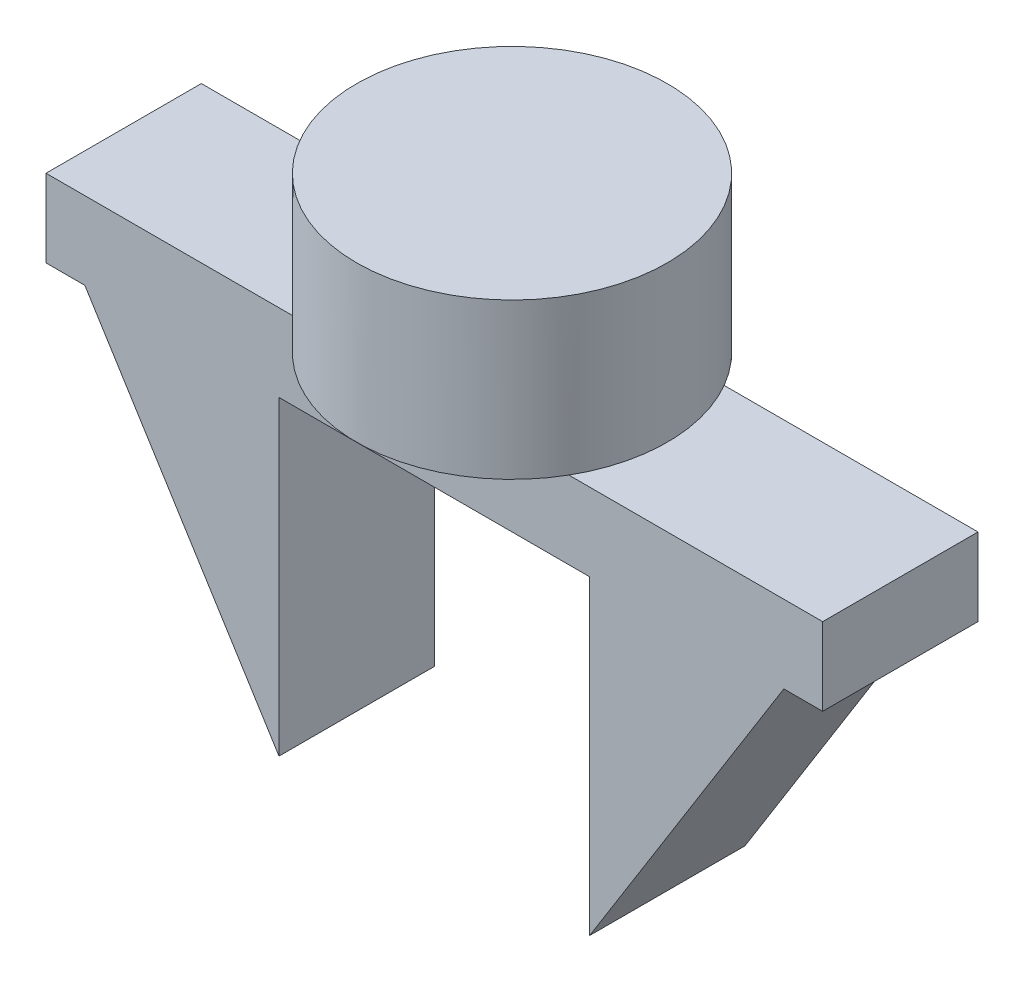
ISO-10303-21;
HEADER;
FILE_DESCRIPTION(('STEP AP214'),'2;1');
FILE_NAME('part.step','',(''),(''),'','','');
FILE_SCHEMA(('AUTOMOTIVE_DESIGN { 1 0 10303 214 1 1 1 1 }'));
ENDSEC;
DATA;
#1=APPLICATION_CONTEXT('core data for automotive mechanical design processes');
#2=APPLICATION_PROTOCOL_DEFINITION('international standard','automotive_design',2000,#1);
#3=PRODUCT_CONTEXT('',#1,'mechanical');
#4=PRODUCT('Part','Part','',(#3));
#5=PRODUCT_RELATED_PRODUCT_CATEGORY('part','',(#4));
#6=PRODUCT_DEFINITION_FORMATION('','',#4);
#7=PRODUCT_DEFINITION_CONTEXT('part definition',#1,'design');
#8=PRODUCT_DEFINITION('design','',#6,#7);
#9=PRODUCT_DEFINITION_SHAPE('','',#8);
#10=(LENGTH_UNIT() NAMED_UNIT(*) SI_UNIT(.MILLI.,.METRE.));
#11=(NAMED_UNIT(*) PLANE_ANGLE_UNIT() SI_UNIT($,.RADIAN.));
#12=(NAMED_UNIT(*) SI_UNIT($,.STERADIAN.) SOLID_ANGLE_UNIT());
#13=UNCERTAINTY_MEASURE_WITH_UNIT(LENGTH_MEASURE(1.E-05),#10,'distance_accuracy_value','');
#14=(GEOMETRIC_REPRESENTATION_CONTEXT(3) GLOBAL_UNCERTAINTY_ASSIGNED_CONTEXT((#13)) GLOBAL_UNIT_ASSIGNED_CONTEXT((#10,
#11,#12)) REPRESENTATION_CONTEXT('',''));
#15=CARTESIAN_POINT('',(0.,0.,0.));
#16=DIRECTION('',(0.,0.,1.));
#17=DIRECTION('',(1.,0.,0.));
#18=AXIS2_PLACEMENT_3D('',#15,#16,#17);
#19=CARTESIAN_POINT('',(50.,0.,20.));
#20=DIRECTION('',(0.,-1.,0.));
#21=DIRECTION('',(0.,0.,-1.));
#22=AXIS2_PLACEMENT_3D('',#19,#20,#21);
#23=PLANE('',#22);
#24=CARTESIAN_POINT('',(0.,0.,10.));
#25=DIRECTION('',(0.,1.,0.));
#26=DIRECTION('',(0.,0.,1.));
#27=AXIS2_PLACEMENT_3D('',#24,#25,#26);
#28=CIRCLE('',#27,20.);
#29=CARTESIAN_POINT('',(17.3205080756888,0.,20.));
#30=VERTEX_POINT('',#29);
#31=CARTESIAN_POINT('',(17.3205080756888,0.,0.));
#32=VERTEX_POINT('',#31);
#33=EDGE_CURVE('E54',#30,#32,#28,.T.);
#34=ORIENTED_EDGE('',*,*,#33,.F.);
#35=DIRECTION('',(-1.,0.,0.));
#36=VECTOR('',#35,1.);
#37=CARTESIAN_POINT('',(50.,0.,20.));
#38=LINE('',#37,#36);
#39=CARTESIAN_POINT('',(50.,0.,20.));
#40=VERTEX_POINT('',#39);
#41=EDGE_CURVE('E140',#40,#30,#38,.T.);
#42=ORIENTED_EDGE('',*,*,#41,.F.);
#43=DIRECTION('',(0.,0.,-1.));
#44=VECTOR('',#43,1.);
#45=CARTESIAN_POINT('',(50.,0.,20.));
#46=LINE('',#45,#44);
#47=CARTESIAN_POINT('',(50.,0.,0.));
#48=VERTEX_POINT('',#47);
#49=EDGE_CURVE('E228',#40,#48,#46,.T.);
#50=ORIENTED_EDGE('',*,*,#49,.T.);
#51=DIRECTION('',(-1.,0.,0.));
#52=VECTOR('',#51,1.);
#53=CARTESIAN_POINT('',(50.,0.,0.));
#54=LINE('',#53,#52);
#55=EDGE_CURVE('E170',#48,#32,#54,.T.);
#56=ORIENTED_EDGE('',*,*,#55,.T.);
#57=EDGE_LOOP('',(#34,#42,#50,#56));
#58=FACE_BOUND('',#57,.T.);
#59=ADVANCED_FACE('F43',(#58),#23,.F.);
#60=CARTESIAN_POINT('',(-50.,0.,20.));
#61=DIRECTION('',(1.,0.,0.));
#62=DIRECTION('',(0.,0.,-1.));
#63=AXIS2_PLACEMENT_3D('',#60,#61,#62);
#64=PLANE('',#63);
#65=DIRECTION('',(0.,-1.,0.));
#66=VECTOR('',#65,1.);
#67=CARTESIAN_POINT('',(-50.,0.,0.));
#68=LINE('',#67,#66);
#69=CARTESIAN_POINT('',(-50.,0.,0.));
#70=VERTEX_POINT('',#69);
#71=CARTESIAN_POINT('',(-50.,-10.,0.));
#72=VERTEX_POINT('',#71);
#73=EDGE_CURVE('E194',#70,#72,#68,.T.);
#74=ORIENTED_EDGE('',*,*,#73,.T.);
#75=DIRECTION('',(0.,0.,-1.));
#76=VECTOR('',#75,1.);
#77=CARTESIAN_POINT('',(-50.,-10.,20.));
#78=LINE('',#77,#76);
#79=CARTESIAN_POINT('',(-50.,-10.,20.));
#80=VERTEX_POINT('',#79);
#81=EDGE_CURVE('E47',#80,#72,#78,.T.);
#82=ORIENTED_EDGE('',*,*,#81,.F.);
#83=DIRECTION('',(0.,-1.,0.));
#84=VECTOR('',#83,1.);
#85=CARTESIAN_POINT('',(-50.,0.,20.));
#86=LINE('',#85,#84);
#87=CARTESIAN_POINT('',(-50.,0.,20.));
#88=VERTEX_POINT('',#87);
#89=EDGE_CURVE('E166',#88,#80,#86,.T.);
#90=ORIENTED_EDGE('',*,*,#89,.F.);
#91=DIRECTION('',(0.,0.,-1.));
#92=VECTOR('',#91,1.);
#93=CARTESIAN_POINT('',(-50.,0.,20.));
#94=LINE('',#93,#92);
#95=EDGE_CURVE('E148',#88,#70,#94,.T.);
#96=ORIENTED_EDGE('',*,*,#95,.T.);
#97=EDGE_LOOP('',(#74,#82,#90,#96));
#98=FACE_BOUND('',#97,.T.);
#99=ADVANCED_FACE('F45',(#98),#64,.F.);
#100=CARTESIAN_POINT('',(-50.,-10.,20.));
#101=DIRECTION('',(0.,1.,0.));
#102=DIRECTION('',(0.,0.,1.));
#103=AXIS2_PLACEMENT_3D('',#100,#101,#102);
#104=PLANE('',#103);
#105=DIRECTION('',(1.,0.,0.));
#106=VECTOR('',#105,1.);
#107=CARTESIAN_POINT('',(-50.,-10.,0.));
#108=LINE('',#107,#106);
#109=CARTESIAN_POINT('',(-45.,-10.,0.));
#110=VERTEX_POINT('',#109);
#111=EDGE_CURVE('E198',#72,#110,#108,.T.);
#112=ORIENTED_EDGE('',*,*,#111,.T.);
#113=DIRECTION('',(0.,0.,-1.));
#114=VECTOR('',#113,1.);
#115=CARTESIAN_POINT('',(-45.,-10.,20.));
#116=LINE('',#115,#114);
#117=CARTESIAN_POINT('',(-45.,-10.,20.));
#118=VERTEX_POINT('',#117);
#119=EDGE_CURVE('E255',#118,#110,#116,.T.);
#120=ORIENTED_EDGE('',*,*,#119,.F.);
#121=DIRECTION('',(1.,0.,0.));
#122=VECTOR('',#121,1.);
#123=CARTESIAN_POINT('',(-50.,-10.,20.));
#124=LINE('',#123,#122);
#125=EDGE_CURVE('E169',#80,#118,#124,.T.);
#126=ORIENTED_EDGE('',*,*,#125,.F.);
#127=ORIENTED_EDGE('',*,*,#81,.T.);
#128=EDGE_LOOP('',(#112,#120,#126,#127));
#129=FACE_BOUND('',#128,.T.);
#130=ADVANCED_FACE('F266',(#129),#104,.F.);
#131=CARTESIAN_POINT('',(-45.,-10.,20.));
#132=DIRECTION('',(0.847998304005088,0.52999894000318,0.));
#133=DIRECTION('',(-0.52999894000318,0.847998304005088,0.));
#134=AXIS2_PLACEMENT_3D('',#131,#132,#133);
#135=PLANE('',#134);
#136=DIRECTION('',(0.52999894000318,-0.847998304005088,0.));
#137=VECTOR('',#136,1.);
#138=CARTESIAN_POINT('',(-45.,-10.,0.));
#139=LINE('',#138,#137);
#140=CARTESIAN_POINT('',(-20.,-50.,0.));
#141=VERTEX_POINT('',#140);
#142=EDGE_CURVE('E201',#110,#141,#139,.T.);
#143=ORIENTED_EDGE('',*,*,#142,.T.);
#144=DIRECTION('',(0.,0.,-1.));
#145=VECTOR('',#144,1.);
#146=CARTESIAN_POINT('',(-20.,-50.,20.));
#147=LINE('',#146,#145);
#148=CARTESIAN_POINT('',(-20.,-50.,20.));
#149=VERTEX_POINT('',#148);
#150=EDGE_CURVE('E252',#149,#141,#147,.T.);
#151=ORIENTED_EDGE('',*,*,#150,.F.);
#152=DIRECTION('',(0.52999894000318,-0.847998304005088,0.));
#153=VECTOR('',#152,1.);
#154=CARTESIAN_POINT('',(-45.,-10.,20.));
#155=LINE('',#154,#153);
#156=EDGE_CURVE('E173',#118,#149,#155,.T.);
#157=ORIENTED_EDGE('',*,*,#156,.F.);
#158=ORIENTED_EDGE('',*,*,#119,.T.);
#159=EDGE_LOOP('',(#143,#151,#157,#158));
#160=FACE_BOUND('',#159,.T.);
#161=ADVANCED_FACE('F274',(#160),#135,.F.);
#162=CARTESIAN_POINT('',(-20.,-50.,20.));
#163=DIRECTION('',(-1.,0.,0.));
#164=DIRECTION('',(0.,0.,1.));
#165=AXIS2_PLACEMENT_3D('',#162,#163,#164);
#166=PLANE('',#165);
#167=DIRECTION('',(0.,1.,0.));
#168=VECTOR('',#167,1.);
#169=CARTESIAN_POINT('',(-20.,-50.,0.));
#170=LINE('',#169,#168);
#171=CARTESIAN_POINT('',(-20.,-10.,0.));
#172=VERTEX_POINT('',#171);
#173=EDGE_CURVE('E204',#141,#172,#170,.T.);
#174=ORIENTED_EDGE('',*,*,#173,.T.);
#175=DIRECTION('',(0.,0.,-1.));
#176=VECTOR('',#175,1.);
#177=CARTESIAN_POINT('',(-20.,-10.,20.));
#178=LINE('',#177,#176);
#179=CARTESIAN_POINT('',(-20.,-10.,20.));
#180=VERTEX_POINT('',#179);
#181=EDGE_CURVE('E248',#180,#172,#178,.T.);
#182=ORIENTED_EDGE('',*,*,#181,.F.);
#183=DIRECTION('',(0.,1.,0.));
#184=VECTOR('',#183,1.);
#185=CARTESIAN_POINT('',(-20.,-50.,20.));
#186=LINE('',#185,#184);
#187=EDGE_CURVE('E176',#149,#180,#186,.T.);
#188=ORIENTED_EDGE('',*,*,#187,.F.);
#189=ORIENTED_EDGE('',*,*,#150,.T.);
#190=EDGE_LOOP('',(#174,#182,#188,#189));
#191=FACE_BOUND('',#190,.T.);
#192=ADVANCED_FACE('F277',(#191),#166,.F.);
#193=CARTESIAN_POINT('',(-20.,-10.,20.));
#194=DIRECTION('',(0.,1.,0.));
#195=DIRECTION('',(0.,0.,1.));
#196=AXIS2_PLACEMENT_3D('',#193,#194,#195);
#197=PLANE('',#196);
#198=DIRECTION('',(1.,0.,0.));
#199=VECTOR('',#198,1.);
#200=CARTESIAN_POINT('',(-20.,-10.,0.));
#201=LINE('',#200,#199);
#202=CARTESIAN_POINT('',(20.,-10.,0.));
#203=VERTEX_POINT('',#202);
#204=EDGE_CURVE('E207',#172,#203,#201,.T.);
#205=ORIENTED_EDGE('',*,*,#204,.T.);
#206=DIRECTION('',(0.,0.,-1.));
#207=VECTOR('',#206,1.);
#208=CARTESIAN_POINT('',(20.,-10.,20.));
#209=LINE('',#208,#207);
#210=CARTESIAN_POINT('',(20.,-10.,20.));
#211=VERTEX_POINT('',#210);
#212=EDGE_CURVE('E244',#211,#203,#209,.T.);
#213=ORIENTED_EDGE('',*,*,#212,.F.);
#214=DIRECTION('',(1.,0.,0.));
#215=VECTOR('',#214,1.);
#216=CARTESIAN_POINT('',(-20.,-10.,20.));
#217=LINE('',#216,#215);
#218=EDGE_CURVE('E179',#180,#211,#217,.T.);
#219=ORIENTED_EDGE('',*,*,#218,.F.);
#220=ORIENTED_EDGE('',*,*,#181,.T.);
#221=EDGE_LOOP('',(#205,#213,#219,#220));
#222=FACE_BOUND('',#221,.T.);
#223=ADVANCED_FACE('F284',(#222),#197,.F.);
#224=CARTESIAN_POINT('',(20.,-50.,20.));
#225=DIRECTION('',(1.,0.,0.));
#226=DIRECTION('',(0.,0.,-1.));
#227=AXIS2_PLACEMENT_3D('',#224,#225,#226);
#228=PLANE('',#227);
#229=DIRECTION('',(0.,-1.,0.));
#230=VECTOR('',#229,1.);
#231=CARTESIAN_POINT('',(20.,-50.,0.));
#232=LINE('',#231,#230);
#233=CARTESIAN_POINT('',(20.,-50.,0.));
#234=VERTEX_POINT('',#233);
#235=EDGE_CURVE('E210',#203,#234,#232,.T.);
#236=ORIENTED_EDGE('',*,*,#235,.T.);
#237=DIRECTION('',(0.,0.,-1.));
#238=VECTOR('',#237,1.);
#239=CARTESIAN_POINT('',(20.,-50.,20.));
#240=LINE('',#239,#238);
#241=CARTESIAN_POINT('',(20.,-50.,20.));
#242=VERTEX_POINT('',#241);
#243=EDGE_CURVE('E240',#242,#234,#240,.T.);
#244=ORIENTED_EDGE('',*,*,#243,.F.);
#245=DIRECTION('',(0.,-1.,0.));
#246=VECTOR('',#245,1.);
#247=CARTESIAN_POINT('',(20.,-50.,20.));
#248=LINE('',#247,#246);
#249=EDGE_CURVE('E182',#211,#242,#248,.T.);
#250=ORIENTED_EDGE('',*,*,#249,.F.);
#251=ORIENTED_EDGE('',*,*,#212,.T.);
#252=EDGE_LOOP('',(#236,#244,#250,#251));
#253=FACE_BOUND('',#252,.T.);
#254=ADVANCED_FACE('F287',(#253),#228,.F.);
#255=CARTESIAN_POINT('',(45.,-10.,20.));
#256=DIRECTION('',(-0.847998304005088,0.52999894000318,0.));
#257=DIRECTION('',(-0.52999894000318,-0.847998304005088,0.));
#258=AXIS2_PLACEMENT_3D('',#255,#256,#257);
#259=PLANE('',#258);
#260=DIRECTION('',(0.52999894000318,0.847998304005088,0.));
#261=VECTOR('',#260,1.);
#262=CARTESIAN_POINT('',(45.,-10.,0.));
#263=LINE('',#262,#261);
#264=CARTESIAN_POINT('',(45.,-10.,0.));
#265=VERTEX_POINT('',#264);
#266=EDGE_CURVE('E213',#234,#265,#263,.T.);
#267=ORIENTED_EDGE('',*,*,#266,.T.);
#268=DIRECTION('',(0.,0.,-1.));
#269=VECTOR('',#268,1.);
#270=CARTESIAN_POINT('',(45.,-10.,20.));
#271=LINE('',#270,#269);
#272=CARTESIAN_POINT('',(45.,-10.,20.));
#273=VERTEX_POINT('',#272);
#274=EDGE_CURVE('E236',#273,#265,#271,.T.);
#275=ORIENTED_EDGE('',*,*,#274,.F.);
#276=DIRECTION('',(0.52999894000318,0.847998304005088,0.));
#277=VECTOR('',#276,1.);
#278=CARTESIAN_POINT('',(45.,-10.,20.));
#279=LINE('',#278,#277);
#280=EDGE_CURVE('E185',#242,#273,#279,.T.);
#281=ORIENTED_EDGE('',*,*,#280,.F.);
#282=ORIENTED_EDGE('',*,*,#243,.T.);
#283=EDGE_LOOP('',(#267,#275,#281,#282));
#284=FACE_BOUND('',#283,.T.);
#285=ADVANCED_FACE('F292',(#284),#259,.F.);
#286=CARTESIAN_POINT('',(50.,-10.,20.));
#287=DIRECTION('',(0.,1.,0.));
#288=DIRECTION('',(0.,0.,1.));
#289=AXIS2_PLACEMENT_3D('',#286,#287,#288);
#290=PLANE('',#289);
#291=DIRECTION('',(1.,0.,0.));
#292=VECTOR('',#291,1.);
#293=CARTESIAN_POINT('',(50.,-10.,0.));
#294=LINE('',#293,#292);
#295=CARTESIAN_POINT('',(50.,-10.,0.));
#296=VERTEX_POINT('',#295);
#297=EDGE_CURVE('E216',#265,#296,#294,.T.);
#298=ORIENTED_EDGE('',*,*,#297,.T.);
#299=DIRECTION('',(0.,0.,-1.));
#300=VECTOR('',#299,1.);
#301=CARTESIAN_POINT('',(50.,-10.,20.));
#302=LINE('',#301,#300);
#303=CARTESIAN_POINT('',(50.,-10.,20.));
#304=VERTEX_POINT('',#303);
#305=EDGE_CURVE('E232',#304,#296,#302,.T.);
#306=ORIENTED_EDGE('',*,*,#305,.F.);
#307=DIRECTION('',(1.,0.,0.));
#308=VECTOR('',#307,1.);
#309=CARTESIAN_POINT('',(50.,-10.,20.));
#310=LINE('',#309,#308);
#311=EDGE_CURVE('E188',#273,#304,#310,.T.);
#312=ORIENTED_EDGE('',*,*,#311,.F.);
#313=ORIENTED_EDGE('',*,*,#274,.T.);
#314=EDGE_LOOP('',(#298,#306,#312,#313));
#315=FACE_BOUND('',#314,.T.);
#316=ADVANCED_FACE('F298',(#315),#290,.F.);
#317=CARTESIAN_POINT('',(50.,0.,20.));
#318=DIRECTION('',(-1.,0.,0.));
#319=DIRECTION('',(0.,0.,1.));
#320=AXIS2_PLACEMENT_3D('',#317,#318,#319);
#321=PLANE('',#320);
#322=DIRECTION('',(0.,1.,0.));
#323=VECTOR('',#322,1.);
#324=CARTESIAN_POINT('',(50.,0.,0.));
#325=LINE('',#324,#323);
#326=EDGE_CURVE('E219',#296,#48,#325,.T.);
#327=ORIENTED_EDGE('',*,*,#326,.T.);
#328=ORIENTED_EDGE('',*,*,#49,.F.);
#329=DIRECTION('',(0.,1.,0.));
#330=VECTOR('',#329,1.);
#331=CARTESIAN_POINT('',(50.,0.,20.));
#332=LINE('',#331,#330);
#333=EDGE_CURVE('E151',#304,#40,#332,.T.);
#334=ORIENTED_EDGE('',*,*,#333,.F.);
#335=ORIENTED_EDGE('',*,*,#305,.T.);
#336=EDGE_LOOP('',(#327,#328,#334,#335));
#337=FACE_BOUND('',#336,.T.);
#338=ADVANCED_FACE('F302',(#337),#321,.F.);
#339=CARTESIAN_POINT('',(-17.3205080756888,0.,0.));
#340=VERTEX_POINT('',#339);
#341=CARTESIAN_POINT('',(-17.3205080756888,0.,20.));
#342=VERTEX_POINT('',#341);
#343=EDGE_CURVE('E11',#340,#342,#28,.T.);
#344=ORIENTED_EDGE('',*,*,#343,.F.);
#345=EDGE_CURVE('E222',#340,#70,#54,.T.);
#346=ORIENTED_EDGE('',*,*,#345,.T.);
#347=ORIENTED_EDGE('',*,*,#95,.F.);
#348=EDGE_CURVE('E138',#342,#88,#38,.T.);
#349=ORIENTED_EDGE('',*,*,#348,.F.);
#350=EDGE_LOOP('',(#344,#346,#347,#349));
#351=FACE_BOUND('',#350,.T.);
#352=ADVANCED_FACE('F146',(#351),#23,.F.);
#353=CARTESIAN_POINT('',(0.,0.,20.));
#354=DIRECTION('',(0.,0.,1.));
#355=DIRECTION('',(1.,0.,0.));
#356=AXIS2_PLACEMENT_3D('',#353,#354,#355);
#357=PLANE('',#356);
#358=ORIENTED_EDGE('',*,*,#89,.T.);
#359=ORIENTED_EDGE('',*,*,#125,.T.);
#360=ORIENTED_EDGE('',*,*,#156,.T.);
#361=ORIENTED_EDGE('',*,*,#187,.T.);
#362=ORIENTED_EDGE('',*,*,#218,.T.);
#363=ORIENTED_EDGE('',*,*,#249,.T.);
#364=ORIENTED_EDGE('',*,*,#280,.T.);
#365=ORIENTED_EDGE('',*,*,#311,.T.);
#366=ORIENTED_EDGE('',*,*,#333,.T.);
#367=ORIENTED_EDGE('',*,*,#41,.T.);
#368=EDGE_CURVE('E135',#30,#342,#38,.T.);
#369=ORIENTED_EDGE('',*,*,#368,.T.);
#370=ORIENTED_EDGE('',*,*,#348,.T.);
#371=EDGE_LOOP('',(#358,#359,#360,#361,#362,#363,#364,#365,#366,#367,#369,#370));
#372=FACE_BOUND('',#371,.T.);
#373=ADVANCED_FACE('F137',(#372),#357,.T.);
#374=CARTESIAN_POINT('',(0.,0.,0.));
#375=DIRECTION('',(0.,0.,1.));
#376=DIRECTION('',(1.,0.,0.));
#377=AXIS2_PLACEMENT_3D('',#374,#375,#376);
#378=PLANE('',#377);
#379=ORIENTED_EDGE('',*,*,#73,.F.);
#380=ORIENTED_EDGE('',*,*,#345,.F.);
#381=EDGE_CURVE('E225',#32,#340,#54,.T.);
#382=ORIENTED_EDGE('',*,*,#381,.F.);
#383=ORIENTED_EDGE('',*,*,#55,.F.);
#384=ORIENTED_EDGE('',*,*,#326,.F.);
#385=ORIENTED_EDGE('',*,*,#297,.F.);
#386=ORIENTED_EDGE('',*,*,#266,.F.);
#387=ORIENTED_EDGE('',*,*,#235,.F.);
#388=ORIENTED_EDGE('',*,*,#204,.F.);
#389=ORIENTED_EDGE('',*,*,#173,.F.);
#390=ORIENTED_EDGE('',*,*,#142,.F.);
#391=ORIENTED_EDGE('',*,*,#111,.F.);
#392=EDGE_LOOP('',(#379,#380,#382,#383,#384,#385,#386,#387,#388,#389,#390,#391));
#393=FACE_BOUND('',#392,.T.);
#394=ADVANCED_FACE('F270',(#393),#378,.F.);
#395=CARTESIAN_POINT('',(0.,0.,10.));
#396=DIRECTION('',(0.,1.,0.));
#397=DIRECTION('',(0.,0.,1.));
#398=AXIS2_PLACEMENT_3D('',#395,#396,#397);
#399=PLANE('',#398);
#400=EDGE_CURVE('E55',#32,#340,#28,.T.);
#401=ORIENTED_EDGE('',*,*,#400,.F.);
#402=ORIENTED_EDGE('',*,*,#381,.T.);
#403=EDGE_LOOP('',(#401,#402));
#404=FACE_BOUND('',#403,.T.);
#405=ADVANCED_FACE('F393',(#404),#399,.F.);
#406=CARTESIAN_POINT('',(0.,20.,10.));
#407=DIRECTION('',(0.,-1.,0.));
#408=DIRECTION('',(0.,0.,-1.));
#409=AXIS2_PLACEMENT_3D('',#406,#407,#408);
#410=CYLINDRICAL_SURFACE('',#409,20.);
#411=CARTESIAN_POINT('',(0.,20.,10.));
#412=DIRECTION('',(0.,1.,0.));
#413=DIRECTION('',(0.,0.,1.));
#414=AXIS2_PLACEMENT_3D('',#411,#412,#413);
#415=CIRCLE('',#414,20.);
#416=CARTESIAN_POINT('',(0.,20.,30.));
#417=VERTEX_POINT('',#416);
#418=EDGE_CURVE('E163',#417,#417,#415,.T.);
#419=ORIENTED_EDGE('',*,*,#418,.F.);
#420=EDGE_LOOP('',(#419));
#421=FACE_BOUND('',#420,.T.);
#422=ORIENTED_EDGE('',*,*,#33,.T.);
#423=ORIENTED_EDGE('',*,*,#400,.T.);
#424=ORIENTED_EDGE('',*,*,#343,.T.);
#425=EDGE_CURVE('E152',#342,#30,#28,.T.);
#426=ORIENTED_EDGE('',*,*,#425,.T.);
#427=EDGE_LOOP('',(#422,#423,#424,#426));
#428=FACE_BOUND('',#427,.T.);
#429=ADVANCED_FACE('F157',(#421,#428),#410,.T.);
#430=CARTESIAN_POINT('',(0.,20.,10.));
#431=DIRECTION('',(0.,1.,0.));
#432=DIRECTION('',(0.,0.,1.));
#433=AXIS2_PLACEMENT_3D('',#430,#431,#432);
#434=PLANE('',#433);
#435=ORIENTED_EDGE('',*,*,#418,.T.);
#436=EDGE_LOOP('',(#435));
#437=FACE_BOUND('',#436,.T.);
#438=ADVANCED_FACE('F409',(#437),#434,.T.);
#439=ORIENTED_EDGE('',*,*,#368,.F.);
#440=ORIENTED_EDGE('',*,*,#425,.F.);
#441=EDGE_LOOP('',(#439,#440));
#442=FACE_BOUND('',#441,.T.);
#443=ADVANCED_FACE('F153',(#442),#399,.F.);
#444=CLOSED_SHELL('',(#59,#99,#130,#161,#192,#223,#254,#285,#316,#338,#352,#373,#394,#405,#429,
#438,#443));
#445=MANIFOLD_SOLID_BREP('B2',#444);
#446=ADVANCED_BREP_SHAPE_REPRESENTATION('',(#18,#445),#14);
#447=SHAPE_DEFINITION_REPRESENTATION(#9,#446);
ENDSEC;
END-ISO-10303-21;
